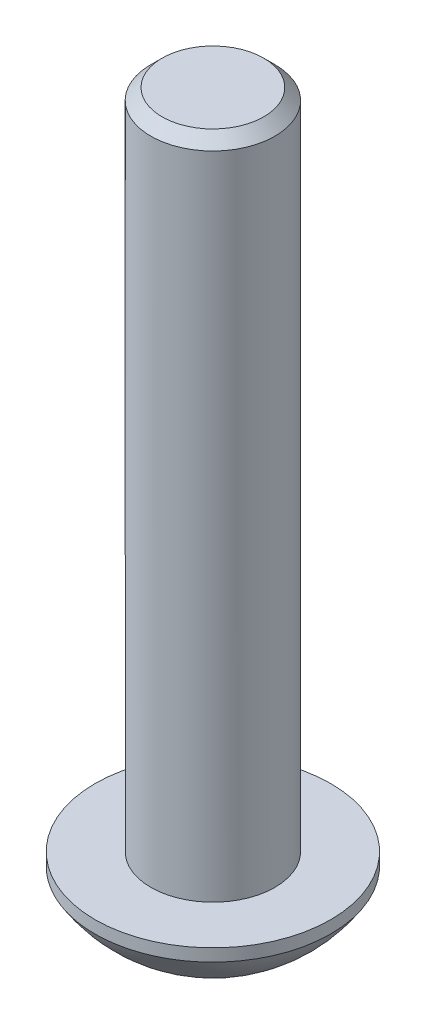
ISO-10303-21;
HEADER;
FILE_DESCRIPTION(('STEP AP214'),'2;1');
FILE_NAME('part.step','',(''),(''),'','','');
FILE_SCHEMA(('AUTOMOTIVE_DESIGN { 1 0 10303 214 1 1 1 1 }'));
ENDSEC;
DATA;
#1=APPLICATION_CONTEXT('core data for automotive mechanical design processes');
#2=APPLICATION_PROTOCOL_DEFINITION('international standard','automotive_design',2000,#1);
#3=PRODUCT_CONTEXT('',#1,'mechanical');
#4=PRODUCT('Part','Part','',(#3));
#5=PRODUCT_RELATED_PRODUCT_CATEGORY('part','',(#4));
#6=PRODUCT_DEFINITION_FORMATION('','',#4);
#7=PRODUCT_DEFINITION_CONTEXT('part definition',#1,'design');
#8=PRODUCT_DEFINITION('design','',#6,#7);
#9=PRODUCT_DEFINITION_SHAPE('','',#8);
#10=(LENGTH_UNIT() NAMED_UNIT(*) SI_UNIT(.MILLI.,.METRE.));
#11=(NAMED_UNIT(*) PLANE_ANGLE_UNIT() SI_UNIT($,.RADIAN.));
#12=(NAMED_UNIT(*) SI_UNIT($,.STERADIAN.) SOLID_ANGLE_UNIT());
#13=UNCERTAINTY_MEASURE_WITH_UNIT(LENGTH_MEASURE(1.E-05),#10,'distance_accuracy_value','');
#14=(GEOMETRIC_REPRESENTATION_CONTEXT(3) GLOBAL_UNCERTAINTY_ASSIGNED_CONTEXT((#13)) GLOBAL_UNIT_ASSIGNED_CONTEXT((#10,
#11,#12)) REPRESENTATION_CONTEXT('',''));
#15=CARTESIAN_POINT('',(0.,0.,0.));
#16=DIRECTION('',(0.,0.,1.));
#17=DIRECTION('',(1.,0.,0.));
#18=AXIS2_PLACEMENT_3D('',#15,#16,#17);
#19=CARTESIAN_POINT('',(0.,55.3856941615436,50.));
#20=DIRECTION('',(0.,-1.,0.));
#21=DIRECTION('',(0.,0.,-1.));
#22=AXIS2_PLACEMENT_3D('',#19,#20,#21);
#23=CONICAL_SURFACE('',#22,1.16145793101623,1.04719755095042);
#24=CARTESIAN_POINT('',(1.15400090066156,55.3899994147026,50.0000016741378));
#25=CARTESIAN_POINT('',(1.12865573940769,55.4046368375096,49.9560758455226));
#26=CARTESIAN_POINT('',(1.10309177152704,55.4179475277996,49.9117708454329));
#27=CARTESIAN_POINT('',(1.05152141041188,55.4411780140498,49.8223941145755));
#28=CARTESIAN_POINT('',(1.02551410257575,55.4510895948782,49.7773207988004));
#29=CARTESIAN_POINT('',(0.973822066513516,55.4665135558622,49.6877332203486));
#30=CARTESIAN_POINT('',(0.948145282097667,55.4721287308101,49.6432327253586));
#31=CARTESIAN_POINT('',(0.896671333206981,55.4788239786819,49.5540231070611));
#32=CARTESIAN_POINT('',(0.870874355080444,55.479909607348,49.509314306711));
#33=CARTESIAN_POINT('',(0.822653891424444,55.4776115151132,49.425743312859));
#34=CARTESIAN_POINT('',(0.800223176816575,55.4747845633783,49.3868685907151));
#35=CARTESIAN_POINT('',(0.755508284709641,55.465834560538,49.3093731103719));
#36=CARTESIAN_POINT('',(0.733224262549901,55.4597084524588,49.2707526213917));
#37=CARTESIAN_POINT('',(0.688417583983071,55.4443983778372,49.1930980658424));
#38=CARTESIAN_POINT('',(0.66590061150706,55.4351495491677,49.1540738501063));
#39=CARTESIAN_POINT('',(0.621202863872176,55.414161803292,49.0766080829617));
#40=CARTESIAN_POINT('',(0.599021514276931,55.4024278224909,49.0381655359964));
#41=CARTESIAN_POINT('',(0.576999378125568,55.3896962754721,48.9999989222289));
#42=B_SPLINE_CURVE_WITH_KNOTS('',3,(#24,#25,#26,#27,#28,#29,#30,#31,#32,#33,#34,#35,#36,#37,#38,
#39,#40,#41),.UNSPECIFIED.,.F.,.F.,(4,2,2,2,2,2,2,2,4),(0.,0.158413101983459,0.317206409897042,
0.47207015065558,0.626743886418754,0.761527875611951,0.896436970073687,1.03434089438759,
1.17197341886136),.UNSPECIFIED.);
#43=CARTESIAN_POINT('',(1.15400090296958,55.3899994786955,50.0000000894703));
#44=VERTEX_POINT('',#43);
#45=CARTESIAN_POINT('',(0.577000674526668,55.3896961752252,48.9999994697893));
#46=VERTEX_POINT('',#45);
#47=EDGE_CURVE('E178',#44,#46,#42,.T.);
#48=ORIENTED_EDGE('',*,*,#47,.F.);
#49=CARTESIAN_POINT('',(0.576999298422029,55.3896962326926,51.0000012587604));
#50=CARTESIAN_POINT('',(0.602352999151581,55.4043583285277,50.9560606754401));
#51=CARTESIAN_POINT('',(0.62792554518021,55.4176952907737,50.9117408270357));
#52=CARTESIAN_POINT('',(0.679513872552088,55.4409804165245,50.8223329723769));
#53=CARTESIAN_POINT('',(0.705530573482894,55.4509203364431,50.7772433724177));
#54=CARTESIAN_POINT('',(0.757241751562797,55.4664006933613,50.6876226153428));
#55=CARTESIAN_POINT('',(0.782928255087489,55.472043976505,50.6431052774286));
#56=CARTESIAN_POINT('',(0.834422789697523,55.4787934217245,50.5538599829082));
#57=CARTESIAN_POINT('',(0.860230632410767,55.4799051567071,50.5091323527689));
#58=CARTESIAN_POINT('',(0.908451521082817,55.4776525119564,50.4255606221015));
#59=CARTESIAN_POINT('',(0.93087171289846,55.4748487325963,50.386704137107));
#60=CARTESIAN_POINT('',(0.97556640521739,55.4659462493147,50.309243665117));
#61=CARTESIAN_POINT('',(0.997840751390623,55.4598444932691,50.2706399455913));
#62=CARTESIAN_POINT('',(1.04262827417148,55.4445833459006,50.1930185889618));
#63=CARTESIAN_POINT('',(1.06513578463309,55.435359117596,50.1540107718681));
#64=CARTESIAN_POINT('',(1.10981514834625,55.4144193258744,50.0765768659478));
#65=CARTESIAN_POINT('',(1.13198757382884,55.402708689164,50.0381497853863));
#66=CARTESIAN_POINT('',(1.15400085197995,55.3899995081345,49.9999985234309));
#67=B_SPLINE_CURVE_WITH_KNOTS('',3,(#49,#50,#51,#52,#53,#54,#55,#56,#57,#58,#59,#60,#61,#62,#63,
#64,#65,#66),.UNSPECIFIED.,.F.,.F.,(4,2,2,2,2,2,2,2,4),(0.,0.158482882789923,0.317347668889016,
0.472278609532784,0.62701895820696,0.761735668587015,0.896577267032088,1.03441063939117,
1.17197340822943),.UNSPECIFIED.);
#68=CARTESIAN_POINT('',(0.577000548079769,55.3896961656045,51.0000006224091));
#69=VERTEX_POINT('',#68);
#70=EDGE_CURVE('E184',#69,#44,#67,.T.);
#71=ORIENTED_EDGE('',*,*,#70,.F.);
#72=CARTESIAN_POINT('',(0.,55.4789119415316,51.));
#73=CARTESIAN_POINT('',(0.0244914554008611,55.4789150582898,51.));
#74=CARTESIAN_POINT('',(0.0489795908257204,55.4783921502542,51.));
#75=CARTESIAN_POINT('',(0.0979078424227522,55.476321705628,51.));
#76=CARTESIAN_POINT('',(0.122347967122291,55.4747743713885,51.));
#77=CARTESIAN_POINT('',(0.195296934769774,55.4686576452971,51.));
#78=CARTESIAN_POINT('',(0.243687873009842,55.4626129454396,51.));
#79=CARTESIAN_POINT('',(0.339832387766223,55.4470681906881,51.));
#80=CARTESIAN_POINT('',(0.387586612647138,55.4375719820607,51.));
#81=CARTESIAN_POINT('',(0.482684583299406,55.4156706471807,51.));
#82=CARTESIAN_POINT('',(0.530025016868663,55.4032510056403,51.));
#83=CARTESIAN_POINT('',(0.577001797534774,55.3896961163337,51.));
#84=B_SPLINE_CURVE_WITH_KNOTS('',3,(#72,#73,#74,#75,#76,#77,#78,#79,#80,#81,#82,#83),
.UNSPECIFIED.,.F.,.F.,(4,2,2,2,2,4),(0.,0.07346259411885,0.146910681762818,0.293048722688192,
0.439024408200675,0.585740770402025),.UNSPECIFIED.);
#85=CARTESIAN_POINT('',(0.,55.4789119414976,51.0000000000223));
#86=VERTEX_POINT('',#85);
#87=EDGE_CURVE('E190',#86,#69,#84,.T.);
#88=ORIENTED_EDGE('',*,*,#87,.F.);
#89=DIRECTION('',(0.,0.499999999999999,-0.86602540378444));
#90=VECTOR('',#89,1.);
#91=CARTESIAN_POINT('',(6.11159985114487E-11,-288070.595576871,499100.));
#92=LINE('',#91,#90);
#93=CARTESIAN_POINT('',(0.,56.056262210717,50.0000000001535));
#94=VERTEX_POINT('',#93);
#95=EDGE_CURVE('E121',#86,#94,#92,.T.);
#96=ORIENTED_EDGE('',*,*,#95,.T.);
#97=DIRECTION('',(0.,0.499999999999999,0.86602540378444));
#98=VECTOR('',#97,1.);
#99=CARTESIAN_POINT('',(0.,-288070.595576871,-499000.));
#100=LINE('',#99,#98);
#101=CARTESIAN_POINT('',(0.,55.4789119414929,48.9999999999891));
#102=VERTEX_POINT('',#101);
#103=EDGE_CURVE('E119',#94,#102,#100,.F.);
#104=ORIENTED_EDGE('',*,*,#103,.T.);
#105=CARTESIAN_POINT('',(0.577001942647014,55.3896960058773,49.00000010477));
#106=CARTESIAN_POINT('',(0.530025159095672,55.4032509428972,49.0000000374838));
#107=CARTESIAN_POINT('',(0.482684716126565,55.4156706075703,49.0000000100078));
#108=CARTESIAN_POINT('',(0.38758672147617,55.4375719659701,48.9999999900428));
#109=CARTESIAN_POINT('',(0.339832482036812,55.4470681751407,48.9999999973779));
#110=CARTESIAN_POINT('',(0.243687940236499,55.4626129348701,49.0000000026251));
#111=CARTESIAN_POINT('',(0.195296989524658,55.468657639241,49.0000000005266));
#112=CARTESIAN_POINT('',(0.122348002208767,55.4747743691843,48.9999999997353));
#113=CARTESIAN_POINT('',(0.0979078705929263,55.4763217042199,48.9999999998676));
#114=CARTESIAN_POINT('',(0.0489796049751585,55.4783921498727,49.0000000001324));
#115=CARTESIAN_POINT('',(0.0244914624455926,55.4789150581322,49.0000000002648));
#116=CARTESIAN_POINT('',(0.,55.4789119415316,49.));
#117=B_SPLINE_CURVE_WITH_KNOTS('',3,(#105,#106,#107,#108,#109,#110,#111,#112,#113,#114,#115,
#116),.UNSPECIFIED.,.F.,.F.,(4,2,2,2,2,4),(0.,0.14671640691081,0.292692134718645,
0.438830214847726,0.512278323286194,0.585740938654936),.UNSPECIFIED.);
#118=EDGE_CURVE('E173',#46,#102,#117,.T.);
#119=ORIENTED_EDGE('',*,*,#118,.F.);
#120=EDGE_LOOP('',(#48,#71,#88,#96,#104,#119));
#121=FACE_BOUND('',#120,.T.);
#122=ADVANCED_FACE('F16',(#121),#23,.F.);
#123=CARTESIAN_POINT('',(0.,55.3856941615436,50.));
#124=DIRECTION('',(0.,-1.,0.));
#125=DIRECTION('',(0.,0.,-1.));
#126=AXIS2_PLACEMENT_3D('',#123,#124,#125);
#127=CONICAL_SURFACE('',#126,1.1614579309935,1.04719755093347);
#128=CARTESIAN_POINT('',(-1.15400090066231,55.3899994146915,49.9999983258664));
#129=CARTESIAN_POINT('',(-1.12865573940725,55.4046368374983,50.0439241544812));
#130=CARTESIAN_POINT('',(-1.10309177152607,55.4179475277883,50.0882291545708));
#131=CARTESIAN_POINT('',(-1.05152141041045,55.4411780140391,50.1776058854282));
#132=CARTESIAN_POINT('',(-1.02551410257437,55.4510895948679,50.2226792012035));
#133=CARTESIAN_POINT('',(-0.97382206651209,55.4665135558524,50.3122667796556));
#134=CARTESIAN_POINT('',(-0.94814528209615,55.4721287308003,50.3567672746457));
#135=CARTESIAN_POINT('',(-0.896671333205322,55.4788239786721,50.4459768929434));
#136=CARTESIAN_POINT('',(-0.870874355078735,55.4799096073382,50.4906856932936));
#137=CARTESIAN_POINT('',(-0.822653891423016,55.477611515103,50.5742566871451));
#138=CARTESIAN_POINT('',(-0.80022317681548,55.474784563368,50.6131314092884));
#139=CARTESIAN_POINT('',(-0.755508284709221,55.4658345605273,50.6906268896304));
#140=CARTESIAN_POINT('',(-0.733224262549825,55.4597084524479,50.72924737861));
#141=CARTESIAN_POINT('',(-0.688417583983676,55.4443983778258,50.8069019341581));
#142=CARTESIAN_POINT('',(-0.665900611508005,55.4351495491562,50.8459261498937));
#143=CARTESIAN_POINT('',(-0.621202863873814,55.41416180328,50.923391917037));
#144=CARTESIAN_POINT('',(-0.599021514278922,55.4024278224788,50.9618344640018));
#145=CARTESIAN_POINT('',(-0.576999378127922,55.3896962754597,51.0000010777687));
#146=B_SPLINE_CURVE_WITH_KNOTS('',3,(#128,#129,#130,#131,#132,#133,#134,#135,#136,#137,#138,
#139,#140,#141,#142,#143,#144,#145),.UNSPECIFIED.,.F.,.F.,(4,2,2,2,2,2,2,2,4),(0.,
0.158413101984003,0.317206409898194,0.472070150657107,0.626743886420604,0.761527875611832,
0.896436970071603,1.03434089438364,1.17197341885552),.UNSPECIFIED.);
#147=CARTESIAN_POINT('',(-1.15400090296871,55.3899994786831,49.9999999105301));
#148=VERTEX_POINT('',#147);
#149=CARTESIAN_POINT('',(-0.577000674526374,55.389696175213,51.0000005302093));
#150=VERTEX_POINT('',#149);
#151=EDGE_CURVE('E214',#148,#150,#146,.T.);
#152=ORIENTED_EDGE('',*,*,#151,.F.);
#153=CARTESIAN_POINT('',(-0.576999450842417,55.3896963337793,48.9999988368488));
#154=CARTESIAN_POINT('',(-0.602353105265045,55.404358391277,49.0439394479283));
#155=CARTESIAN_POINT('',(-0.627925630002851,55.417695334581,49.0882593037444));
#156=CARTESIAN_POINT('',(-0.679513936945432,55.440980440041,49.1776671554854));
#157=CARTESIAN_POINT('',(-0.705530638794097,55.4509203586227,49.2227567450771));
#158=CARTESIAN_POINT('',(-0.757241813081482,55.4664007091993,49.312377487075));
#159=CARTESIAN_POINT('',(-0.78292831205463,55.4720439873491,49.3568948201804));
#160=CARTESIAN_POINT('',(-0.834422838834975,55.4787934247775,49.4461401033683));
#161=CARTESIAN_POINT('',(-0.86023067826781,55.4799051569776,49.4908677269847));
#162=CARTESIAN_POINT('',(-0.908451560146304,55.4776525080071,49.5744394453539));
#163=CARTESIAN_POINT('',(-0.930871748514028,55.4748487271075,49.613295924551));
#164=CARTESIAN_POINT('',(-0.975566434077241,55.4659462419385,49.6907563849643));
#165=CARTESIAN_POINT('',(-0.997840776942339,55.4598444855377,49.7293600987099));
#166=CARTESIAN_POINT('',(-1.04262829268067,55.4445833385732,49.8069814430955));
#167=CARTESIAN_POINT('',(-1.06513579941317,55.4353591111014,49.845989253736));
#168=CARTESIAN_POINT('',(-1.10981515568959,55.4144193219777,49.923423146787));
#169=CARTESIAN_POINT('',(-1.13198757746539,55.4027086870391,49.9618502209339));
#170=CARTESIAN_POINT('',(-1.15400085197945,55.3899995081218,50.0000014765667));
#171=B_SPLINE_CURVE_WITH_KNOTS('',3,(#153,#154,#155,#156,#157,#158,#159,#160,#161,#162,#163,
#164,#165,#166,#167,#168,#169,#170),.UNSPECIFIED.,.F.,.F.,(4,2,2,2,2,2,2,2,4),(0.,
0.158482856327467,0.317347617300145,0.472278536732642,0.627018863631145,0.761735554119665,
0.896577132991677,1.03441048298457,1.17197322902569),.UNSPECIFIED.);
#172=CARTESIAN_POINT('',(-0.577001081367167,55.3896960493325,48.9999994528157));
#173=VERTEX_POINT('',#172);
#174=EDGE_CURVE('E20',#173,#148,#171,.T.);
#175=ORIENTED_EDGE('',*,*,#174,.F.);
#176=CARTESIAN_POINT('',(0.,55.4789119415221,49.));
#177=CARTESIAN_POINT('',(-0.02449146376858,55.4789150582846,49.));
#178=CARTESIAN_POINT('',(-0.0489796075576083,55.4783921498894,49.));
#179=CARTESIAN_POINT('',(-0.0979078758311905,55.4763217038534,49.));
#180=CARTESIAN_POINT('',(-0.12234800884313,55.4747743685643,49.));
#181=CARTESIAN_POINT('',(-0.195297001104958,55.4686576383681,49.));
#182=CARTESIAN_POINT('',(-0.243687955529133,55.4626129344988,49.));
#183=CARTESIAN_POINT('',(-0.339832502059281,55.4470681697823,49.));
#184=CARTESIAN_POINT('',(-0.387586742531119,55.437571955208,49.));
#185=CARTESIAN_POINT('',(-0.482684744076088,55.4156706070531,49.));
#186=CARTESIAN_POINT('',(-0.530025192943088,55.4032509581711,49.));
#187=CARTESIAN_POINT('',(-0.577001988679979,55.3896960611668,49.));
#188=B_SPLINE_CURVE_WITH_KNOTS('',3,(#176,#177,#178,#179,#180,#181,#182,#183,#184,#185,#186,
#187),.UNSPECIFIED.,.F.,.F.,(4,2,2,2,2,4),(0.,0.0734626192098973,0.146910731920556,
0.293048822367717,0.439024557175179,0.585740969274842),.UNSPECIFIED.);
#189=EDGE_CURVE('E102',#102,#173,#188,.T.);
#190=ORIENTED_EDGE('',*,*,#189,.F.);
#191=ORIENTED_EDGE('',*,*,#103,.F.);
#192=ORIENTED_EDGE('',*,*,#95,.F.);
#193=CARTESIAN_POINT('',(-0.577001942644274,55.3896960058663,50.9999998952319));
#194=CARTESIAN_POINT('',(-0.530025159093077,55.4032509428859,50.9999999625169));
#195=CARTESIAN_POINT('',(-0.482684716124206,55.4156706075591,50.9999999899924));
#196=CARTESIAN_POINT('',(-0.387586721474344,55.4375719659593,51.0000000099571));
#197=CARTESIAN_POINT('',(-0.339832482035285,55.4470681751303,51.0000000026221));
#198=CARTESIAN_POINT('',(-0.243687940235483,55.4626129348601,50.999999997375));
#199=CARTESIAN_POINT('',(-0.195296989523855,55.4686576392312,50.9999999994734));
#200=CARTESIAN_POINT('',(-0.122348002208271,55.4747743691747,51.0000000002647));
#201=CARTESIAN_POINT('',(-0.0979078705925301,55.4763217042103,51.0000000001324));
#202=CARTESIAN_POINT('',(-0.0489796049749605,55.4783921498632,50.9999999998676));
#203=CARTESIAN_POINT('',(-0.0244914624454934,55.4789150581227,50.9999999997352));
#204=CARTESIAN_POINT('',(0.,55.4789119415221,51.));
#205=B_SPLINE_CURVE_WITH_KNOTS('',3,(#193,#194,#195,#196,#197,#198,#199,#200,#201,#202,#203,
#204),.UNSPECIFIED.,.F.,.F.,(4,2,2,2,2,4),(0.,0.146716406910163,0.292692134717337,
0.438830214845827,0.512278323284006,0.585740938652451),.UNSPECIFIED.);
#206=EDGE_CURVE('E208',#150,#86,#205,.T.);
#207=ORIENTED_EDGE('',*,*,#206,.F.);
#208=EDGE_LOOP('',(#152,#175,#190,#191,#192,#207));
#209=FACE_BOUND('',#208,.T.);
#210=ADVANCED_FACE('F218',(#209),#127,.F.);
#211=CARTESIAN_POINT('',(-1.16338017114409,56.1416573160268,50.0162567957428));
#212=DIRECTION('',(0.866156744758905,0.,0.499772441725889));
#213=DIRECTION('',(0.499772441725889,0.,-0.866156744758905));
#214=AXIS2_PLACEMENT_3D('',#211,#212,#213);
#215=PLANE('',#214);
#216=ORIENTED_EDGE('',*,*,#174,.T.);
#217=DIRECTION('',(0.,1.,0.));
#218=VECTOR('',#217,1.);
#219=CARTESIAN_POINT('',(-1.15400000000044,56.1416573160268,50.));
#220=LINE('',#219,#218);
#221=CARTESIAN_POINT('',(-1.1540001086347,54.3500000000004,50.0000005655087));
#222=VERTEX_POINT('',#221);
#223=EDGE_CURVE('E90',#222,#148,#220,.T.);
#224=ORIENTED_EDGE('',*,*,#223,.F.);
#225=DIRECTION('',(-0.499772441725889,0.,0.866156744758905));
#226=VECTOR('',#225,1.);
#227=CARTESIAN_POINT('',(-0.577000000000469,54.3500000000004,49.));
#228=LINE('',#227,#226);
#229=CARTESIAN_POINT('',(-0.577002794184489,54.3500000000004,49.));
#230=VERTEX_POINT('',#229);
#231=EDGE_CURVE('E84',#230,#222,#228,.T.);
#232=ORIENTED_EDGE('',*,*,#231,.F.);
#233=DIRECTION('',(0.,1.,0.));
#234=VECTOR('',#233,1.);
#235=CARTESIAN_POINT('',(-0.577002794184489,56.1416573160268,49.));
#236=LINE('',#235,#234);
#237=EDGE_CURVE('E87',#173,#230,#236,.F.);
#238=ORIENTED_EDGE('',*,*,#237,.F.);
#239=EDGE_LOOP('',(#216,#224,#232,#238));
#240=FACE_BOUND('',#239,.T.);
#241=ADVANCED_FACE('F86',(#240),#215,.T.);
#242=CARTESIAN_POINT('',(-0.567619828856837,56.1416573160268,51.0162567957428));
#243=DIRECTION('',(0.866156744758905,0.,-0.499772441725888));
#244=DIRECTION('',(-0.499772441725888,0.,-0.866156744758905));
#245=AXIS2_PLACEMENT_3D('',#242,#243,#244);
#246=PLANE('',#245);
#247=ORIENTED_EDGE('',*,*,#151,.T.);
#248=DIRECTION('',(0.,1.,0.));
#249=VECTOR('',#248,1.);
#250=CARTESIAN_POINT('',(-0.577000000000469,56.1416573160268,51.));
#251=LINE('',#250,#249);
#252=CARTESIAN_POINT('',(-0.576999760199159,54.3500000000004,51.));
#253=VERTEX_POINT('',#252);
#254=EDGE_CURVE('E213',#253,#150,#251,.T.);
#255=ORIENTED_EDGE('',*,*,#254,.F.);
#256=DIRECTION('',(0.499772441725889,0.,0.866156744758905));
#257=VECTOR('',#256,1.);
#258=CARTESIAN_POINT('',(-1.15400000000047,54.3500000000004,50.));
#259=LINE('',#258,#257);
#260=EDGE_CURVE('E95',#222,#253,#259,.T.);
#261=ORIENTED_EDGE('',*,*,#260,.F.);
#262=ORIENTED_EDGE('',*,*,#223,.T.);
#263=EDGE_LOOP('',(#247,#255,#261,#262));
#264=FACE_BOUND('',#263,.T.);
#265=ADVANCED_FACE('F204',(#264),#246,.T.);
#266=CARTESIAN_POINT('',(0.595768884316635,56.1416573160268,51.));
#267=DIRECTION('',(0.,0.,-1.));
#268=DIRECTION('',(-1.,0.,0.));
#269=AXIS2_PLACEMENT_3D('',#266,#267,#268);
#270=PLANE('',#269);
#271=ORIENTED_EDGE('',*,*,#87,.T.);
#272=DIRECTION('',(0.,1.,0.));
#273=VECTOR('',#272,1.);
#274=CARTESIAN_POINT('',(0.576999999999561,56.1416573160268,51.));
#275=LINE('',#274,#273);
#276=CARTESIAN_POINT('',(0.57700017447713,54.3500000000004,50.9999996976125));
#277=VERTEX_POINT('',#276);
#278=EDGE_CURVE('E189',#277,#69,#275,.T.);
#279=ORIENTED_EDGE('',*,*,#278,.F.);
#280=DIRECTION('',(1.,0.,0.));
#281=VECTOR('',#280,1.);
#282=CARTESIAN_POINT('',(1.29478799999953,54.3500000000004,51.));
#283=LINE('',#282,#281);
#284=EDGE_CURVE('E127',#253,#277,#283,.T.);
#285=ORIENTED_EDGE('',*,*,#284,.F.);
#286=ORIENTED_EDGE('',*,*,#254,.T.);
#287=ORIENTED_EDGE('',*,*,#206,.T.);
#288=EDGE_LOOP('',(#271,#279,#285,#286,#287));
#289=FACE_BOUND('',#288,.T.);
#290=ADVANCED_FACE('F199',(#289),#270,.T.);
#291=CARTESIAN_POINT('',(1.16338017114316,56.1416573160268,49.9837432042572));
#292=DIRECTION('',(-0.866156744758905,0.,-0.499772441725888));
#293=DIRECTION('',(-0.499772441725888,0.,0.866156744758905));
#294=AXIS2_PLACEMENT_3D('',#291,#292,#293);
#295=PLANE('',#294);
#296=ORIENTED_EDGE('',*,*,#70,.T.);
#297=DIRECTION('',(0.,1.,0.));
#298=VECTOR('',#297,1.);
#299=CARTESIAN_POINT('',(1.15399999999952,56.1416573160268,50.));
#300=LINE('',#299,#298);
#301=CARTESIAN_POINT('',(1.15399983675132,54.3500000000004,49.9999997170742));
#302=VERTEX_POINT('',#301);
#303=EDGE_CURVE('E183',#302,#44,#300,.T.);
#304=ORIENTED_EDGE('',*,*,#303,.F.);
#305=DIRECTION('',(0.499772441725887,0.,-0.866156744758906));
#306=VECTOR('',#305,1.);
#307=CARTESIAN_POINT('',(0.576999999999542,54.3500000000004,51.));
#308=LINE('',#307,#306);
#309=EDGE_CURVE('E112',#277,#302,#308,.T.);
#310=ORIENTED_EDGE('',*,*,#309,.F.);
#311=ORIENTED_EDGE('',*,*,#278,.T.);
#312=EDGE_LOOP('',(#296,#304,#310,#311));
#313=FACE_BOUND('',#312,.T.);
#314=ADVANCED_FACE('F196',(#313),#295,.T.);
#315=CARTESIAN_POINT('',(0.567619828855917,56.1416573160268,48.9837432042572));
#316=DIRECTION('',(-0.866156744758905,0.,0.499772441725888));
#317=DIRECTION('',(0.499772441725888,0.,0.866156744758905));
#318=AXIS2_PLACEMENT_3D('',#315,#316,#317);
#319=PLANE('',#318);
#320=ORIENTED_EDGE('',*,*,#47,.T.);
#321=DIRECTION('',(0.,1.,0.));
#322=VECTOR('',#321,1.);
#323=CARTESIAN_POINT('',(0.576999999999542,56.1416573160268,49.));
#324=LINE('',#323,#322);
#325=CARTESIAN_POINT('',(0.576999760198233,54.3500000000004,49.));
#326=VERTEX_POINT('',#325);
#327=EDGE_CURVE('E39',#326,#46,#324,.T.);
#328=ORIENTED_EDGE('',*,*,#327,.F.);
#329=DIRECTION('',(-0.499772441725887,0.,-0.866156744758906));
#330=VECTOR('',#329,1.);
#331=CARTESIAN_POINT('',(1.15399999999954,54.3500000000004,50.));
#332=LINE('',#331,#330);
#333=EDGE_CURVE('E106',#302,#326,#332,.T.);
#334=ORIENTED_EDGE('',*,*,#333,.F.);
#335=ORIENTED_EDGE('',*,*,#303,.T.);
#336=EDGE_LOOP('',(#320,#328,#334,#335));
#337=FACE_BOUND('',#336,.T.);
#338=ADVANCED_FACE('F169',(#337),#319,.T.);
#339=CARTESIAN_POINT('',(-0.595768884317562,56.1416573160268,49.));
#340=DIRECTION('',(0.,0.,1.));
#341=DIRECTION('',(1.,0.,0.));
#342=AXIS2_PLACEMENT_3D('',#339,#340,#341);
#343=PLANE('',#342);
#344=ORIENTED_EDGE('',*,*,#189,.T.);
#345=ORIENTED_EDGE('',*,*,#237,.T.);
#346=DIRECTION('',(1.,0.,0.));
#347=VECTOR('',#346,1.);
#348=CARTESIAN_POINT('',(1.29478799999953,54.3500000000004,49.));
#349=LINE('',#348,#347);
#350=EDGE_CURVE('E99',#326,#230,#349,.F.);
#351=ORIENTED_EDGE('',*,*,#350,.F.);
#352=ORIENTED_EDGE('',*,*,#327,.T.);
#353=ORIENTED_EDGE('',*,*,#118,.T.);
#354=EDGE_LOOP('',(#344,#345,#351,#352,#353));
#355=FACE_BOUND('',#354,.T.);
#356=ADVANCED_FACE('F98',(#355),#343,.T.);
#357=CARTESIAN_POINT('',(1.29478799999953,54.3500000000004,51.294788));
#358=DIRECTION('',(0.,-1.,0.));
#359=DIRECTION('',(0.,0.,-1.));
#360=AXIS2_PLACEMENT_3D('',#357,#358,#359);
#361=PLANE('',#360);
#362=CARTESIAN_POINT('',(0.,54.3500000000004,48.7305999999998));
#363=CARTESIAN_POINT('',(-0.0712497170084137,54.3500000000005,48.7306040341634));
#364=CARTESIAN_POINT('',(-0.14262623833596,54.3500000000005,48.7366317414297));
#365=CARTESIAN_POINT('',(-0.248110710043157,54.3500000000004,48.7545679197723));
#366=CARTESIAN_POINT('',(-0.283053519696232,54.3500000000003,48.7620447227894));
#367=CARTESIAN_POINT('',(-0.352219595995652,54.3500000000005,48.7799207967561));
#368=CARTESIAN_POINT('',(-0.386442254403624,54.3500000000008,48.7903224393067));
#369=CARTESIAN_POINT('',(-0.48749016601211,54.350000000001,48.8257715354758));
#370=CARTESIAN_POINT('',(-0.552865435971408,54.3500000000004,48.8550922732043));
#371=CARTESIAN_POINT('',(-0.677760345660976,54.3500000000004,48.9243074418358));
#372=CARTESIAN_POINT('',(-0.737279762675927,54.3500000000009,48.9642022746898));
#373=CARTESIAN_POINT('',(-0.820874200263398,54.3500000000007,49.031072353456));
#374=CARTESIAN_POINT('',(-0.847807312888987,54.3500000000005,49.0545513413248));
#375=CARTESIAN_POINT('',(-0.899576631867,54.3500000000003,49.1036683269898));
#376=CARTESIAN_POINT('',(-0.924414834916242,54.3500000000003,49.1293042213495));
#377=CARTESIAN_POINT('',(-0.995569652293717,54.3500000000005,49.2092423228781));
#378=CARTESIAN_POINT('',(-1.03854455663574,54.3500000000007,49.2665894417575));
#379=CARTESIAN_POINT('',(-1.11423114705362,54.3500000000007,49.387653444534));
#380=CARTESIAN_POINT('',(-1.14694322012531,54.3500000000005,49.4513700881264));
#381=CARTESIAN_POINT('',(-1.20121195885969,54.3500000000003,49.583397973181));
#382=CARTESIAN_POINT('',(-1.22276874366606,54.3500000000004,49.6517091655625));
#383=CARTESIAN_POINT('',(-1.25410619844746,54.3500000000004,49.7909794662216));
#384=CARTESIAN_POINT('',(-1.26388680553272,54.3500000000004,49.8619385886383));
#385=CARTESIAN_POINT('',(-1.27139711927342,54.3500000000004,50.0044917268469));
#386=CARTESIAN_POINT('',(-1.26912682592887,54.3500000000004,50.0760857426389));
#387=CARTESIAN_POINT('',(-1.25259695286988,54.3500000000004,50.2178779004422));
#388=CARTESIAN_POINT('',(-1.23833743718276,54.3500000000004,50.2880760499059));
#389=CARTESIAN_POINT('',(-1.1982422145856,54.3500000000004,50.4250754351623));
#390=CARTESIAN_POINT('',(-1.17240638403418,54.3500000000004,50.4918766346653));
#391=CARTESIAN_POINT('',(-1.10985982552559,54.3500000000004,50.6202233555274));
#392=CARTESIAN_POINT('',(-1.07314868746448,54.3500000000004,50.6817686785766));
#393=CARTESIAN_POINT('',(-1.01078742964461,54.3500000000004,50.768740982416));
#394=CARTESIAN_POINT('',(-0.988780470555685,54.3500000000004,50.796844881825));
#395=CARTESIAN_POINT('',(-0.942458805505119,54.3500000000004,50.8511297233113));
#396=CARTESIAN_POINT('',(-0.918141892877464,54.3500000000004,50.8773087834034));
#397=CARTESIAN_POINT('',(-0.842036731265002,54.3500000000004,50.9525925253782));
#398=CARTESIAN_POINT('',(-0.787038836177591,54.3500000000003,50.9985206238171));
#399=CARTESIAN_POINT('',(-0.670108252977904,54.3500000000005,51.0804762017091));
#400=CARTESIAN_POINT('',(-0.608175828583813,54.3500000000008,51.1165040574858));
#401=CARTESIAN_POINT('',(-0.511412192285615,54.3500000000006,51.1623747185886));
#402=CARTESIAN_POINT('',(-0.478471960373291,54.3500000000005,51.1763147916812));
#403=CARTESIAN_POINT('',(-0.411567144661478,54.3500000000003,51.20135966672));
#404=CARTESIAN_POINT('',(-0.377603414933843,54.3500000000003,51.2124667632263));
#405=CARTESIAN_POINT('',(-0.274587574673426,54.3500000000006,51.2413876366633));
#406=CARTESIAN_POINT('',(-0.204239560342526,54.3500000000012,51.254882003318));
#407=CARTESIAN_POINT('',(-0.111228039945713,54.3500000000007,51.26471510236));
#408=CARTESIAN_POINT('',(-0.0890218191372402,54.3500000000005,51.2664704226174));
#409=CARTESIAN_POINT('',(-0.0445478653774861,54.3500000000003,51.2688135021888));
#410=CARTESIAN_POINT('',(-0.0222801324262045,54.3500000000004,51.2694012615027));
#411=CARTESIAN_POINT('',(0.071249717008417,54.3500000000005,51.2693959658366));
#412=CARTESIAN_POINT('',(0.142626238335965,54.3500000000005,51.2633682585703));
#413=CARTESIAN_POINT('',(0.248110710043163,54.3500000000004,51.2454320802277));
#414=CARTESIAN_POINT('',(0.283053519696238,54.3500000000003,51.2379552772106));
#415=CARTESIAN_POINT('',(0.352219595995657,54.3500000000005,51.2200792032439));
#416=CARTESIAN_POINT('',(0.38644225440363,54.3500000000008,51.2096775606933));
#417=CARTESIAN_POINT('',(0.487490166012119,54.350000000001,51.1742284645242));
#418=CARTESIAN_POINT('',(0.552865435971418,54.3500000000004,51.1449077267957));
#419=CARTESIAN_POINT('',(0.677760345660979,54.3500000000004,51.0756925581641));
#420=CARTESIAN_POINT('',(0.737279762675919,54.3500000000009,51.0357977253102));
#421=CARTESIAN_POINT('',(0.820874200263399,54.3500000000007,50.968927646544));
#422=CARTESIAN_POINT('',(0.847807312888994,54.3500000000005,50.9454486586752));
#423=CARTESIAN_POINT('',(0.899576631867012,54.3500000000003,50.8963316730102));
#424=CARTESIAN_POINT('',(0.924414834916251,54.3500000000003,50.8706957786506));
#425=CARTESIAN_POINT('',(0.995569652293724,54.3500000000005,50.7907576771219));
#426=CARTESIAN_POINT('',(1.03854455663574,54.3500000000007,50.7334105582425));
#427=CARTESIAN_POINT('',(1.11423114705363,54.3500000000007,50.612346555466));
#428=CARTESIAN_POINT('',(1.14694322012533,54.3500000000005,50.5486299118736));
#429=CARTESIAN_POINT('',(1.2012119588597,54.3500000000003,50.416602026819));
#430=CARTESIAN_POINT('',(1.22276874366607,54.3500000000004,50.3482908344375));
#431=CARTESIAN_POINT('',(1.25410619844747,54.3500000000004,50.2090205337784));
#432=CARTESIAN_POINT('',(1.26388680553272,54.3500000000004,50.1380614113617));
#433=CARTESIAN_POINT('',(1.27139711927342,54.3500000000004,49.9955082731531));
#434=CARTESIAN_POINT('',(1.26912682592887,54.3500000000004,49.9239142573611));
#435=CARTESIAN_POINT('',(1.25259695286988,54.3500000000004,49.7821220995578));
#436=CARTESIAN_POINT('',(1.23833743718275,54.3500000000004,49.7119239500941));
#437=CARTESIAN_POINT('',(1.1982422145856,54.3500000000004,49.5749245648377));
#438=CARTESIAN_POINT('',(1.17240638403419,54.3500000000004,49.5081233653347));
#439=CARTESIAN_POINT('',(1.10985982552559,54.3500000000004,49.3797766444726));
#440=CARTESIAN_POINT('',(1.07314868746446,54.3500000000004,49.3182313214234));
#441=CARTESIAN_POINT('',(1.0107874296446,54.3500000000004,49.231259017584));
#442=CARTESIAN_POINT('',(0.988780470555691,54.3500000000004,49.203155118175));
#443=CARTESIAN_POINT('',(0.942458805505132,54.3500000000004,49.1488702766887));
#444=CARTESIAN_POINT('',(0.918141892877469,54.3500000000004,49.1226912165966));
#445=CARTESIAN_POINT('',(0.842036731264996,54.3500000000004,49.0474074746218));
#446=CARTESIAN_POINT('',(0.787038836177593,54.3500000000003,49.0014793761829));
#447=CARTESIAN_POINT('',(0.670108252977912,54.3500000000005,48.919523798291));
#448=CARTESIAN_POINT('',(0.608175828583819,54.3500000000008,48.8834959425142));
#449=CARTESIAN_POINT('',(0.511412192285616,54.3500000000006,48.8376252814114));
#450=CARTESIAN_POINT('',(0.478471960373291,54.3500000000005,48.8236852083188));
#451=CARTESIAN_POINT('',(0.411567144661476,54.3500000000003,48.79864033328));
#452=CARTESIAN_POINT('',(0.377603414933842,54.3500000000003,48.7875332367737));
#453=CARTESIAN_POINT('',(0.274587574673423,54.3500000000006,48.7586123633367));
#454=CARTESIAN_POINT('',(0.204239560342519,54.3500000000012,48.745117996682));
#455=CARTESIAN_POINT('',(0.111228039945705,54.3500000000007,48.73528489764));
#456=CARTESIAN_POINT('',(0.0890218191372346,54.3500000000005,48.7335295773826));
#457=CARTESIAN_POINT('',(0.0445478653774842,54.3500000000003,48.7311864978112));
#458=CARTESIAN_POINT('',(0.0222801324262044,54.3500000000004,48.7305987384973));
#459=CARTESIAN_POINT('',(0.,54.3500000000004,48.7305999999998));
#460=B_SPLINE_CURVE_WITH_KNOTS('',3,(#362,#363,#364,#365,#366,#367,#368,#369,#370,#371,#372,
#373,#374,#375,#376,#377,#378,#379,#380,#381,#382,#383,#384,#385,#386,#387,#388,#389,#390,#391,
#392,#393,#394,#395,#396,#397,#398,#399,#400,#401,#402,#403,#404,#405,#406,#407,#408,#409,#410,
#411,#412,#413,#414,#415,#416,#417,#418,#419,#420,#421,#422,#423,#424,#425,#426,#427,#428,#429,
#430,#431,#432,#433,#434,#435,#436,#437,#438,#439,#440,#441,#442,#443,#444,#445,#446,#447,#448,
#449,#450,#451,#452,#453,#454,#455,#456,#457,#458,#459),.UNSPECIFIED.,.T.,.F.,(4,2,2,2,2,2,2,2,
2,2,2,2,2,2,2,2,2,2,2,2,2,2,2,2,2,2,2,2,2,2,2,2,2,2,2,2,2,2,2,2,2,2,2,2,2,2,2,2,4),(0.,
0.213645475550447,0.320749003460516,0.427939627755309,0.641809911302927,0.855688325824982,
0.962767663398114,1.06974376036207,1.28362731776068,1.49750280896471,1.71137601583158,
1.92525036486687,2.1391247139021,2.35299792076873,2.56687341197258,2.78075696937114,
2.88773306633496,2.99481240390805,3.20869081843035,3.42256110197792,3.52975172627288,
3.63685525418323,3.85050072973362,3.91730870718789,3.98411668464219,4.19776216019264,
4.30486568810271,4.4120563123975,4.62592659594512,4.83980501046718,4.94688434804031,
5.05386044500426,5.26774400240288,5.48161949360691,5.69549270047378,5.90936704950907,
6.1232413985443,6.33711460541092,6.55099009661479,6.76487365401334,6.87184975097715,
6.97892908855025,7.19280750307254,7.40667778662011,7.51386841091508,7.62097193882543,
7.83461741437583,7.90142539183009,7.96823336928438),.UNSPECIFIED.);
#461=CARTESIAN_POINT('',(0.,54.3500000000004,48.7305999999998));
#462=VERTEX_POINT('',#461);
#463=EDGE_CURVE('E107',#462,#462,#460,.T.);
#464=ORIENTED_EDGE('',*,*,#463,.F.);
#465=EDGE_LOOP('',(#464));
#466=FACE_BOUND('',#465,.T.);
#467=ORIENTED_EDGE('',*,*,#333,.T.);
#468=ORIENTED_EDGE('',*,*,#350,.T.);
#469=ORIENTED_EDGE('',*,*,#231,.T.);
#470=ORIENTED_EDGE('',*,*,#260,.T.);
#471=ORIENTED_EDGE('',*,*,#284,.T.);
#472=ORIENTED_EDGE('',*,*,#309,.T.);
#473=EDGE_LOOP('',(#467,#468,#469,#470,#471,#472));
#474=FACE_BOUND('',#473,.T.);
#475=ADVANCED_FACE('F104',(#466,#474),#361,.T.);
#476=CARTESIAN_POINT('',(0.,57.4365272740744,50.));
#477=DIRECTION('',(0.,0.,-1.));
#478=DIRECTION('',(-1.,0.,0.));
#479=AXIS2_PLACEMENT_3D('',#476,#477,#478);
#480=SPHERICAL_SURFACE('',#479,3.33736827059933);
#481=ORIENTED_EDGE('',*,*,#463,.T.);
#482=EDGE_LOOP('',(#481));
#483=FACE_BOUND('',#482,.T.);
#484=CARTESIAN_POINT('',(0.,55.7000000000004,50.));
#485=DIRECTION('',(0.,1.,0.));
#486=DIRECTION('',(0.,0.,1.));
#487=AXIS2_PLACEMENT_3D('',#484,#485,#486);
#488=CIRCLE('',#487,2.85);
#489=CARTESIAN_POINT('',(0.,55.7000000000004,52.85));
#490=VERTEX_POINT('',#489);
#491=EDGE_CURVE('E110',#490,#490,#488,.T.);
#492=ORIENTED_EDGE('',*,*,#491,.F.);
#493=EDGE_LOOP('',(#492));
#494=FACE_BOUND('',#493,.T.);
#495=ADVANCED_FACE('F159',(#483,#494),#480,.T.);
#496=CARTESIAN_POINT('',(0.,55.7000000000004,50.));
#497=DIRECTION('',(0.,1.,0.));
#498=DIRECTION('',(0.,0.,1.));
#499=AXIS2_PLACEMENT_3D('',#496,#497,#498);
#500=CYLINDRICAL_SURFACE('',#499,2.85);
#501=ORIENTED_EDGE('',*,*,#491,.T.);
#502=EDGE_LOOP('',(#501));
#503=FACE_BOUND('',#502,.T.);
#504=CARTESIAN_POINT('',(0.,56.0000000000004,50.));
#505=DIRECTION('',(0.,1.,0.));
#506=DIRECTION('',(0.,0.,1.));
#507=AXIS2_PLACEMENT_3D('',#504,#505,#506);
#508=CIRCLE('',#507,2.85);
#509=CARTESIAN_POINT('',(0.,56.0000000000004,52.85));
#510=VERTEX_POINT('',#509);
#511=EDGE_CURVE('E145',#510,#510,#508,.T.);
#512=ORIENTED_EDGE('',*,*,#511,.F.);
#513=EDGE_LOOP('',(#512));
#514=FACE_BOUND('',#513,.T.);
#515=ADVANCED_FACE('F249',(#503,#514),#500,.T.);
#516=CARTESIAN_POINT('',(-1.50000000000046,72.0000000000004,51.5));
#517=DIRECTION('',(0.,1.,0.));
#518=DIRECTION('',(0.,0.,1.));
#519=AXIS2_PLACEMENT_3D('',#516,#517,#518);
#520=PLANE('',#519);
#521=CARTESIAN_POINT('',(0.,72.0000000000027,50.));
#522=DIRECTION('',(0.,-1.,0.));
#523=DIRECTION('',(0.,0.,-1.));
#524=AXIS2_PLACEMENT_3D('',#521,#522,#523);
#525=CIRCLE('',#524,1.22939999998835);
#526=CARTESIAN_POINT('',(0.,72.0000000000027,48.7706000000117));
#527=VERTEX_POINT('',#526);
#528=EDGE_CURVE('E142',#527,#527,#525,.T.);
#529=ORIENTED_EDGE('',*,*,#528,.F.);
#530=EDGE_LOOP('',(#529));
#531=FACE_BOUND('',#530,.T.);
#532=ADVANCED_FACE('F246',(#531),#520,.T.);
#533=CARTESIAN_POINT('',(-2.90700000000046,56.0000000000004,52.907));
#534=DIRECTION('',(0.,1.,0.));
#535=DIRECTION('',(0.,0.,1.));
#536=AXIS2_PLACEMENT_3D('',#533,#534,#535);
#537=PLANE('',#536);
#538=ORIENTED_EDGE('',*,*,#511,.T.);
#539=EDGE_LOOP('',(#538));
#540=FACE_BOUND('',#539,.T.);
#541=CARTESIAN_POINT('',(0.,56.0000000000004,50.));
#542=DIRECTION('',(0.,1.,0.));
#543=DIRECTION('',(0.,0.,1.));
#544=AXIS2_PLACEMENT_3D('',#541,#542,#543);
#545=CIRCLE('',#544,1.5);
#546=CARTESIAN_POINT('',(0.,56.0000000000004,51.5));
#547=VERTEX_POINT('',#546);
#548=EDGE_CURVE('E30',#547,#547,#545,.T.);
#549=ORIENTED_EDGE('',*,*,#548,.F.);
#550=EDGE_LOOP('',(#549));
#551=FACE_BOUND('',#550,.T.);
#552=ADVANCED_FACE('F239',(#540,#551),#537,.T.);
#553=CARTESIAN_POINT('',(0.,71.7294000000379,50.));
#554=DIRECTION('',(0.,-1.,0.));
#555=DIRECTION('',(0.,0.,-1.));
#556=AXIS2_PLACEMENT_3D('',#553,#554,#555);
#557=CONICAL_SURFACE('',#556,1.49999999995316,0.785398163397448);
#558=CARTESIAN_POINT('',(0.,71.7294000000004,50.));
#559=DIRECTION('',(0.,-1.,0.));
#560=DIRECTION('',(0.,0.,-1.));
#561=AXIS2_PLACEMENT_3D('',#558,#559,#560);
#562=CIRCLE('',#561,1.5);
#563=CARTESIAN_POINT('',(0.,71.7294000000004,48.5));
#564=VERTEX_POINT('',#563);
#565=EDGE_CURVE('E10',#564,#564,#562,.T.);
#566=ORIENTED_EDGE('',*,*,#565,.F.);
#567=EDGE_LOOP('',(#566));
#568=FACE_BOUND('',#567,.T.);
#569=ORIENTED_EDGE('',*,*,#528,.T.);
#570=EDGE_LOOP('',(#569));
#571=FACE_BOUND('',#570,.T.);
#572=ADVANCED_FACE('F233',(#568,#571),#557,.T.);
#573=CARTESIAN_POINT('',(0.,56.5000000000004,50.));
#574=DIRECTION('',(0.,-1.,0.));
#575=DIRECTION('',(0.,0.,-1.));
#576=AXIS2_PLACEMENT_3D('',#573,#574,#575);
#577=CYLINDRICAL_SURFACE('',#576,1.5);
#578=ORIENTED_EDGE('',*,*,#548,.T.);
#579=EDGE_LOOP('',(#578));
#580=FACE_BOUND('',#579,.T.);
#581=ORIENTED_EDGE('',*,*,#565,.T.);
#582=EDGE_LOOP('',(#581));
#583=FACE_BOUND('',#582,.T.);
#584=ADVANCED_FACE('F231',(#580,#583),#577,.T.);
#585=CLOSED_SHELL('',(#122,#210,#241,#265,#290,#314,#338,#356,#475,#495,#515,#532,#552,#572,#584));
#586=MANIFOLD_SOLID_BREP('B1',#585);
#587=ADVANCED_BREP_SHAPE_REPRESENTATION('',(#18,#586),#14);
#588=SHAPE_DEFINITION_REPRESENTATION(#9,#587);
ENDSEC;
END-ISO-10303-21;
